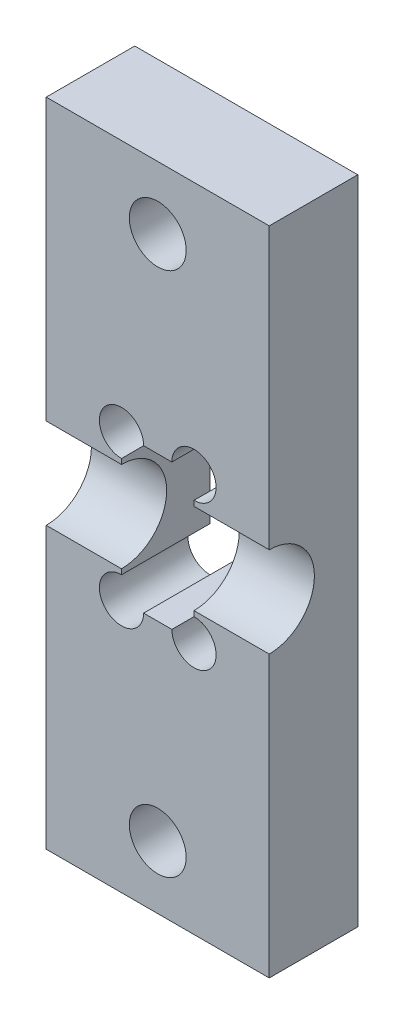
ISO-10303-21;
HEADER;
FILE_DESCRIPTION(('STEP AP214'),'2;1');
FILE_NAME('part.step','',(''),(''),'','','');
FILE_SCHEMA(('AUTOMOTIVE_DESIGN { 1 0 10303 214 1 1 1 1 }'));
ENDSEC;
DATA;
#1=APPLICATION_CONTEXT('core data for automotive mechanical design processes');
#2=APPLICATION_PROTOCOL_DEFINITION('international standard','automotive_design',2000,#1);
#3=PRODUCT_CONTEXT('',#1,'mechanical');
#4=PRODUCT('Part','Part','',(#3));
#5=PRODUCT_RELATED_PRODUCT_CATEGORY('part','',(#4));
#6=PRODUCT_DEFINITION_FORMATION('','',#4);
#7=PRODUCT_DEFINITION_CONTEXT('part definition',#1,'design');
#8=PRODUCT_DEFINITION('design','',#6,#7);
#9=PRODUCT_DEFINITION_SHAPE('','',#8);
#10=(LENGTH_UNIT() NAMED_UNIT(*) SI_UNIT(.MILLI.,.METRE.));
#11=(NAMED_UNIT(*) PLANE_ANGLE_UNIT() SI_UNIT($,.RADIAN.));
#12=(NAMED_UNIT(*) SI_UNIT($,.STERADIAN.) SOLID_ANGLE_UNIT());
#13=UNCERTAINTY_MEASURE_WITH_UNIT(LENGTH_MEASURE(1.E-05),#10,'distance_accuracy_value','');
#14=(GEOMETRIC_REPRESENTATION_CONTEXT(3) GLOBAL_UNCERTAINTY_ASSIGNED_CONTEXT((#13)) GLOBAL_UNIT_ASSIGNED_CONTEXT((#10,
#11,#12)) REPRESENTATION_CONTEXT('',''));
#15=CARTESIAN_POINT('',(0.,0.,0.));
#16=DIRECTION('',(0.,0.,1.));
#17=DIRECTION('',(1.,0.,0.));
#18=AXIS2_PLACEMENT_3D('',#15,#16,#17);
#19=CARTESIAN_POINT('',(0.,0.,7.9375));
#20=DIRECTION('',(0.,0.,-1.));
#21=DIRECTION('',(-1.,0.,0.));
#22=AXIS2_PLACEMENT_3D('',#19,#20,#21);
#23=PLANE('',#22);
#24=CARTESIAN_POINT('',(9.99999999999999,52.78,7.9375));
#25=DIRECTION('',(0.,0.,1.));
#26=DIRECTION('',(1.,0.,0.));
#27=AXIS2_PLACEMENT_3D('',#24,#25,#26);
#28=CIRCLE('',#27,2.54999999999999);
#29=CARTESIAN_POINT('',(12.55,52.78,7.9375));
#30=VERTEX_POINT('',#29);
#31=EDGE_CURVE('E184',#30,#30,#28,.T.);
#32=ORIENTED_EDGE('',*,*,#31,.F.);
#33=EDGE_LOOP('',(#32));
#34=FACE_BOUND('',#33,.T.);
#35=DIRECTION('',(0.,-1.,0.));
#36=VECTOR('',#35,1.);
#37=CARTESIAN_POINT('',(0.,0.,7.9375));
#38=LINE('',#37,#36);
#39=CARTESIAN_POINT('',(0.,58.42,7.9375));
#40=VERTEX_POINT('',#39);
#41=CARTESIAN_POINT('',(0.,33.26,7.9375));
#42=VERTEX_POINT('',#41);
#43=EDGE_CURVE('E158',#40,#42,#38,.T.);
#44=ORIENTED_EDGE('',*,*,#43,.T.);
#45=DIRECTION('',(1.,0.,0.));
#46=VECTOR('',#45,1.);
#47=CARTESIAN_POINT('',(0.,33.26,7.9375));
#48=LINE('',#47,#46);
#49=CARTESIAN_POINT('',(6.74999999999999,33.26,7.9375));
#50=VERTEX_POINT('',#49);
#51=EDGE_CURVE('E144',#42,#50,#48,.T.);
#52=ORIENTED_EDGE('',*,*,#51,.T.);
#53=DIRECTION('',(0.,-1.,0.));
#54=VECTOR('',#53,1.);
#55=CARTESIAN_POINT('',(6.74999999999999,33.725625,7.9375));
#56=LINE('',#55,#54);
#57=CARTESIAN_POINT('',(6.74999999999999,33.725625,7.9375));
#58=VERTEX_POINT('',#57);
#59=EDGE_CURVE('E302',#58,#50,#56,.T.);
#60=ORIENTED_EDGE('',*,*,#59,.F.);
#61=CARTESIAN_POINT('',(6.74999999999999,35.71,7.9375));
#62=DIRECTION('',(0.,0.,1.));
#63=DIRECTION('',(-1.,0.,0.));
#64=AXIS2_PLACEMENT_3D('',#61,#62,#63);
#65=CIRCLE('',#64,1.984375);
#66=CARTESIAN_POINT('',(8.73437499999999,35.71,7.9375));
#67=VERTEX_POINT('',#66);
#68=EDGE_CURVE('E305',#67,#58,#65,.T.);
#69=ORIENTED_EDGE('',*,*,#68,.F.);
#70=DIRECTION('',(-1.,0.,0.));
#71=VECTOR('',#70,1.);
#72=CARTESIAN_POINT('',(11.265625,35.71,7.9375));
#73=LINE('',#72,#71);
#74=CARTESIAN_POINT('',(11.265625,35.71,7.9375));
#75=VERTEX_POINT('',#74);
#76=EDGE_CURVE('E307',#75,#67,#73,.T.);
#77=ORIENTED_EDGE('',*,*,#76,.F.);
#78=CARTESIAN_POINT('',(13.25,35.71,7.9375));
#79=DIRECTION('',(0.,0.,1.));
#80=DIRECTION('',(1.,0.,0.));
#81=AXIS2_PLACEMENT_3D('',#78,#79,#80);
#82=CIRCLE('',#81,1.984375);
#83=CARTESIAN_POINT('',(13.25,33.725625,7.9375));
#84=VERTEX_POINT('',#83);
#85=EDGE_CURVE('E309',#84,#75,#82,.T.);
#86=ORIENTED_EDGE('',*,*,#85,.F.);
#87=DIRECTION('',(0.,1.,0.));
#88=VECTOR('',#87,1.);
#89=CARTESIAN_POINT('',(13.25,24.694375,7.9375));
#90=LINE('',#89,#88);
#91=CARTESIAN_POINT('',(13.25,33.26,7.9375));
#92=VERTEX_POINT('',#91);
#93=EDGE_CURVE('E314',#92,#84,#90,.T.);
#94=ORIENTED_EDGE('',*,*,#93,.F.);
#95=CARTESIAN_POINT('',(20.,33.26,7.9375));
#96=VERTEX_POINT('',#95);
#97=EDGE_CURVE('E49',#92,#96,#48,.T.);
#98=ORIENTED_EDGE('',*,*,#97,.T.);
#99=DIRECTION('',(0.,1.,0.));
#100=VECTOR('',#99,1.);
#101=CARTESIAN_POINT('',(20.,0.,7.9375));
#102=LINE('',#101,#100);
#103=CARTESIAN_POINT('',(20.,58.42,7.9375));
#104=VERTEX_POINT('',#103);
#105=EDGE_CURVE('E168',#96,#104,#102,.T.);
#106=ORIENTED_EDGE('',*,*,#105,.T.);
#107=DIRECTION('',(-1.,0.,0.));
#108=VECTOR('',#107,1.);
#109=CARTESIAN_POINT('',(0.,58.42,7.9375));
#110=LINE('',#109,#108);
#111=EDGE_CURVE('E164',#104,#40,#110,.T.);
#112=ORIENTED_EDGE('',*,*,#111,.T.);
#113=EDGE_LOOP('',(#44,#52,#60,#69,#77,#86,#94,#98,#106,#112));
#114=FACE_BOUND('',#113,.T.);
#115=ADVANCED_FACE('F34',(#34,#114),#23,.F.);
#116=CARTESIAN_POINT('',(10.,5.63999999999999,7.9375));
#117=DIRECTION('',(0.,0.,1.));
#118=DIRECTION('',(1.,0.,0.));
#119=AXIS2_PLACEMENT_3D('',#116,#117,#118);
#120=CIRCLE('',#119,2.55);
#121=CARTESIAN_POINT('',(12.55,5.63999999999999,7.9375));
#122=VERTEX_POINT('',#121);
#123=EDGE_CURVE('E243',#122,#122,#120,.T.);
#124=ORIENTED_EDGE('',*,*,#123,.F.);
#125=EDGE_LOOP('',(#124));
#126=FACE_BOUND('',#125,.T.);
#127=CARTESIAN_POINT('',(20.,0.,7.9375));
#128=VERTEX_POINT('',#127);
#129=CARTESIAN_POINT('',(20.,25.16,7.9375));
#130=VERTEX_POINT('',#129);
#131=EDGE_CURVE('E175',#128,#130,#102,.T.);
#132=ORIENTED_EDGE('',*,*,#131,.T.);
#133=DIRECTION('',(1.,0.,0.));
#134=VECTOR('',#133,1.);
#135=CARTESIAN_POINT('',(0.,25.16,7.9375));
#136=LINE('',#135,#134);
#137=CARTESIAN_POINT('',(13.25,25.16,7.9375));
#138=VERTEX_POINT('',#137);
#139=EDGE_CURVE('E152',#138,#130,#136,.T.);
#140=ORIENTED_EDGE('',*,*,#139,.F.);
#141=CARTESIAN_POINT('',(13.25,24.694375,7.9375));
#142=VERTEX_POINT('',#141);
#143=EDGE_CURVE('E311',#142,#138,#90,.T.);
#144=ORIENTED_EDGE('',*,*,#143,.F.);
#145=CARTESIAN_POINT('',(13.25,22.71,7.9375));
#146=DIRECTION('',(0.,0.,1.));
#147=DIRECTION('',(-1.,0.,0.));
#148=AXIS2_PLACEMENT_3D('',#145,#146,#147);
#149=CIRCLE('',#148,1.984375);
#150=CARTESIAN_POINT('',(11.265625,22.71,7.9375));
#151=VERTEX_POINT('',#150);
#152=EDGE_CURVE('E275',#151,#142,#149,.T.);
#153=ORIENTED_EDGE('',*,*,#152,.F.);
#154=DIRECTION('',(1.,0.,0.));
#155=VECTOR('',#154,1.);
#156=CARTESIAN_POINT('',(8.73437499999999,22.71,7.9375));
#157=LINE('',#156,#155);
#158=CARTESIAN_POINT('',(8.73437499999999,22.71,7.9375));
#159=VERTEX_POINT('',#158);
#160=EDGE_CURVE('E271',#159,#151,#157,.T.);
#161=ORIENTED_EDGE('',*,*,#160,.F.);
#162=CARTESIAN_POINT('',(6.74999999999999,22.71,7.9375));
#163=DIRECTION('',(0.,0.,1.));
#164=DIRECTION('',(-1.,0.,0.));
#165=AXIS2_PLACEMENT_3D('',#162,#163,#164);
#166=CIRCLE('',#165,1.984375);
#167=CARTESIAN_POINT('',(6.74999999999999,24.694375,7.9375));
#168=VERTEX_POINT('',#167);
#169=EDGE_CURVE('E299',#168,#159,#166,.T.);
#170=ORIENTED_EDGE('',*,*,#169,.F.);
#171=CARTESIAN_POINT('',(6.74999999999999,25.16,7.9375));
#172=VERTEX_POINT('',#171);
#173=EDGE_CURVE('E304',#172,#168,#56,.T.);
#174=ORIENTED_EDGE('',*,*,#173,.F.);
#175=CARTESIAN_POINT('',(0.,25.16,7.9375));
#176=VERTEX_POINT('',#175);
#177=EDGE_CURVE('E56',#176,#172,#136,.T.);
#178=ORIENTED_EDGE('',*,*,#177,.F.);
#179=CARTESIAN_POINT('',(0.,0.,7.9375));
#180=VERTEX_POINT('',#179);
#181=EDGE_CURVE('E160',#176,#180,#38,.T.);
#182=ORIENTED_EDGE('',*,*,#181,.T.);
#183=DIRECTION('',(1.,0.,0.));
#184=VECTOR('',#183,1.);
#185=CARTESIAN_POINT('',(0.,0.,7.9375));
#186=LINE('',#185,#184);
#187=EDGE_CURVE('E166',#180,#128,#186,.T.);
#188=ORIENTED_EDGE('',*,*,#187,.T.);
#189=EDGE_LOOP('',(#132,#140,#144,#153,#161,#170,#174,#178,#182,#188));
#190=FACE_BOUND('',#189,.T.);
#191=ADVANCED_FACE('F226',(#126,#190),#23,.F.);
#192=CARTESIAN_POINT('',(0.,0.,0.));
#193=DIRECTION('',(0.,0.,-1.));
#194=DIRECTION('',(-1.,0.,0.));
#195=AXIS2_PLACEMENT_3D('',#192,#193,#194);
#196=PLANE('',#195);
#197=CARTESIAN_POINT('',(9.99999999999999,52.78,0.));
#198=DIRECTION('',(0.,0.,1.));
#199=DIRECTION('',(1.,0.,0.));
#200=AXIS2_PLACEMENT_3D('',#197,#198,#199);
#201=CIRCLE('',#200,2.54999999999999);
#202=CARTESIAN_POINT('',(12.55,52.78,0.));
#203=VERTEX_POINT('',#202);
#204=EDGE_CURVE('E172',#203,#203,#201,.T.);
#205=ORIENTED_EDGE('',*,*,#204,.T.);
#206=EDGE_LOOP('',(#205));
#207=FACE_BOUND('',#206,.T.);
#208=DIRECTION('',(0.,-1.,0.));
#209=VECTOR('',#208,1.);
#210=CARTESIAN_POINT('',(0.,0.,0.));
#211=LINE('',#210,#209);
#212=CARTESIAN_POINT('',(0.,58.42,0.));
#213=VERTEX_POINT('',#212);
#214=CARTESIAN_POINT('',(0.,0.,0.));
#215=VERTEX_POINT('',#214);
#216=EDGE_CURVE('E180',#213,#215,#211,.T.);
#217=ORIENTED_EDGE('',*,*,#216,.F.);
#218=DIRECTION('',(-1.,0.,0.));
#219=VECTOR('',#218,1.);
#220=CARTESIAN_POINT('',(0.,58.42,0.));
#221=LINE('',#220,#219);
#222=CARTESIAN_POINT('',(20.,58.42,0.));
#223=VERTEX_POINT('',#222);
#224=EDGE_CURVE('E170',#223,#213,#221,.T.);
#225=ORIENTED_EDGE('',*,*,#224,.F.);
#226=DIRECTION('',(0.,1.,0.));
#227=VECTOR('',#226,1.);
#228=CARTESIAN_POINT('',(20.,0.,0.));
#229=LINE('',#228,#227);
#230=CARTESIAN_POINT('',(20.,0.,0.));
#231=VERTEX_POINT('',#230);
#232=EDGE_CURVE('E186',#231,#223,#229,.T.);
#233=ORIENTED_EDGE('',*,*,#232,.F.);
#234=DIRECTION('',(1.,0.,0.));
#235=VECTOR('',#234,1.);
#236=CARTESIAN_POINT('',(0.,0.,0.));
#237=LINE('',#236,#235);
#238=EDGE_CURVE('E183',#215,#231,#237,.T.);
#239=ORIENTED_EDGE('',*,*,#238,.F.);
#240=EDGE_LOOP('',(#217,#225,#233,#239));
#241=FACE_BOUND('',#240,.T.);
#242=CARTESIAN_POINT('',(10.,5.63999999999999,0.));
#243=DIRECTION('',(0.,0.,1.));
#244=DIRECTION('',(1.,0.,0.));
#245=AXIS2_PLACEMENT_3D('',#242,#243,#244);
#246=CIRCLE('',#245,2.55);
#247=CARTESIAN_POINT('',(12.55,5.63999999999999,0.));
#248=VERTEX_POINT('',#247);
#249=EDGE_CURVE('E246',#248,#248,#246,.T.);
#250=ORIENTED_EDGE('',*,*,#249,.T.);
#251=EDGE_LOOP('',(#250));
#252=FACE_BOUND('',#251,.T.);
#253=DIRECTION('',(1.,0.,0.));
#254=VECTOR('',#253,1.);
#255=CARTESIAN_POINT('',(8.73437499999999,22.71,0.));
#256=LINE('',#255,#254);
#257=CARTESIAN_POINT('',(8.73437499999999,22.71,0.));
#258=VERTEX_POINT('',#257);
#259=CARTESIAN_POINT('',(11.265625,22.71,0.));
#260=VERTEX_POINT('',#259);
#261=EDGE_CURVE('E272',#258,#260,#256,.T.);
#262=ORIENTED_EDGE('',*,*,#261,.T.);
#263=CARTESIAN_POINT('',(13.25,22.71,0.));
#264=DIRECTION('',(0.,0.,1.));
#265=DIRECTION('',(-1.,0.,0.));
#266=AXIS2_PLACEMENT_3D('',#263,#264,#265);
#267=CIRCLE('',#266,1.984375);
#268=CARTESIAN_POINT('',(13.25,24.694375,0.));
#269=VERTEX_POINT('',#268);
#270=EDGE_CURVE('E294',#260,#269,#267,.T.);
#271=ORIENTED_EDGE('',*,*,#270,.T.);
#272=DIRECTION('',(0.,1.,0.));
#273=VECTOR('',#272,1.);
#274=CARTESIAN_POINT('',(13.25,24.694375,0.));
#275=LINE('',#274,#273);
#276=CARTESIAN_POINT('',(13.25,33.725625,0.));
#277=VERTEX_POINT('',#276);
#278=EDGE_CURVE('E291',#269,#277,#275,.T.);
#279=ORIENTED_EDGE('',*,*,#278,.T.);
#280=CARTESIAN_POINT('',(13.25,35.71,0.));
#281=DIRECTION('',(0.,0.,1.));
#282=DIRECTION('',(1.,0.,0.));
#283=AXIS2_PLACEMENT_3D('',#280,#281,#282);
#284=CIRCLE('',#283,1.984375);
#285=CARTESIAN_POINT('',(11.265625,35.71,0.));
#286=VERTEX_POINT('',#285);
#287=EDGE_CURVE('E288',#277,#286,#284,.T.);
#288=ORIENTED_EDGE('',*,*,#287,.T.);
#289=DIRECTION('',(-1.,0.,0.));
#290=VECTOR('',#289,1.);
#291=CARTESIAN_POINT('',(11.265625,35.71,0.));
#292=LINE('',#291,#290);
#293=CARTESIAN_POINT('',(8.73437499999999,35.71,0.));
#294=VERTEX_POINT('',#293);
#295=EDGE_CURVE('E285',#286,#294,#292,.T.);
#296=ORIENTED_EDGE('',*,*,#295,.T.);
#297=CARTESIAN_POINT('',(6.74999999999999,35.71,0.));
#298=DIRECTION('',(0.,0.,1.));
#299=DIRECTION('',(-1.,0.,0.));
#300=AXIS2_PLACEMENT_3D('',#297,#298,#299);
#301=CIRCLE('',#300,1.984375);
#302=CARTESIAN_POINT('',(6.74999999999999,33.725625,0.));
#303=VERTEX_POINT('',#302);
#304=EDGE_CURVE('E282',#294,#303,#301,.T.);
#305=ORIENTED_EDGE('',*,*,#304,.T.);
#306=DIRECTION('',(0.,-1.,0.));
#307=VECTOR('',#306,1.);
#308=CARTESIAN_POINT('',(6.74999999999999,33.725625,0.));
#309=LINE('',#308,#307);
#310=CARTESIAN_POINT('',(6.74999999999999,24.694375,0.));
#311=VERTEX_POINT('',#310);
#312=EDGE_CURVE('E279',#303,#311,#309,.T.);
#313=ORIENTED_EDGE('',*,*,#312,.T.);
#314=CARTESIAN_POINT('',(6.74999999999999,22.71,0.));
#315=DIRECTION('',(0.,0.,1.));
#316=DIRECTION('',(-1.,0.,0.));
#317=AXIS2_PLACEMENT_3D('',#314,#315,#316);
#318=CIRCLE('',#317,1.984375);
#319=EDGE_CURVE('E276',#311,#258,#318,.T.);
#320=ORIENTED_EDGE('',*,*,#319,.T.);
#321=EDGE_LOOP('',(#262,#271,#279,#288,#296,#305,#313,#320));
#322=FACE_BOUND('',#321,.T.);
#323=ADVANCED_FACE('F203',(#207,#241,#252,#322),#196,.T.);
#324=CARTESIAN_POINT('',(0.,0.,7.9375));
#325=DIRECTION('',(1.,0.,0.));
#326=DIRECTION('',(0.,1.,0.));
#327=AXIS2_PLACEMENT_3D('',#324,#325,#326);
#328=PLANE('',#327);
#329=ORIENTED_EDGE('',*,*,#181,.F.);
#330=CARTESIAN_POINT('',(0.,29.21,7.9375));
#331=DIRECTION('',(1.,0.,0.));
#332=DIRECTION('',(0.,1.,0.));
#333=AXIS2_PLACEMENT_3D('',#330,#331,#332);
#334=CIRCLE('',#333,4.05);
#335=EDGE_CURVE('E147',#176,#42,#334,.T.);
#336=ORIENTED_EDGE('',*,*,#335,.T.);
#337=ORIENTED_EDGE('',*,*,#43,.F.);
#338=DIRECTION('',(0.,0.,-1.));
#339=VECTOR('',#338,1.);
#340=CARTESIAN_POINT('',(0.,58.42,7.9375));
#341=LINE('',#340,#339);
#342=EDGE_CURVE('E179',#40,#213,#341,.T.);
#343=ORIENTED_EDGE('',*,*,#342,.T.);
#344=ORIENTED_EDGE('',*,*,#216,.T.);
#345=DIRECTION('',(0.,0.,-1.));
#346=VECTOR('',#345,1.);
#347=CARTESIAN_POINT('',(0.,0.,7.9375));
#348=LINE('',#347,#346);
#349=EDGE_CURVE('E42',#180,#215,#348,.T.);
#350=ORIENTED_EDGE('',*,*,#349,.F.);
#351=EDGE_LOOP('',(#329,#336,#337,#343,#344,#350));
#352=FACE_BOUND('',#351,.T.);
#353=ADVANCED_FACE('F36',(#352),#328,.F.);
#354=CARTESIAN_POINT('',(0.,0.,7.9375));
#355=DIRECTION('',(0.,1.,0.));
#356=DIRECTION('',(-1.,0.,0.));
#357=AXIS2_PLACEMENT_3D('',#354,#355,#356);
#358=PLANE('',#357);
#359=ORIENTED_EDGE('',*,*,#238,.T.);
#360=DIRECTION('',(0.,0.,-1.));
#361=VECTOR('',#360,1.);
#362=CARTESIAN_POINT('',(20.,0.,7.9375));
#363=LINE('',#362,#361);
#364=EDGE_CURVE('E193',#128,#231,#363,.T.);
#365=ORIENTED_EDGE('',*,*,#364,.F.);
#366=ORIENTED_EDGE('',*,*,#187,.F.);
#367=ORIENTED_EDGE('',*,*,#349,.T.);
#368=EDGE_LOOP('',(#359,#365,#366,#367));
#369=FACE_BOUND('',#368,.T.);
#370=ADVANCED_FACE('F198',(#369),#358,.F.);
#371=CARTESIAN_POINT('',(20.,0.,7.9375));
#372=DIRECTION('',(-1.,0.,0.));
#373=DIRECTION('',(0.,-1.,0.));
#374=AXIS2_PLACEMENT_3D('',#371,#372,#373);
#375=PLANE('',#374);
#376=ORIENTED_EDGE('',*,*,#105,.F.);
#377=CARTESIAN_POINT('',(20.,29.21,7.9375));
#378=DIRECTION('',(1.,0.,0.));
#379=DIRECTION('',(0.,1.,0.));
#380=AXIS2_PLACEMENT_3D('',#377,#378,#379);
#381=CIRCLE('',#380,4.05);
#382=EDGE_CURVE('E161',#130,#96,#381,.T.);
#383=ORIENTED_EDGE('',*,*,#382,.F.);
#384=ORIENTED_EDGE('',*,*,#131,.F.);
#385=ORIENTED_EDGE('',*,*,#364,.T.);
#386=ORIENTED_EDGE('',*,*,#232,.T.);
#387=DIRECTION('',(0.,0.,-1.));
#388=VECTOR('',#387,1.);
#389=CARTESIAN_POINT('',(20.,58.42,7.9375));
#390=LINE('',#389,#388);
#391=EDGE_CURVE('E190',#104,#223,#390,.T.);
#392=ORIENTED_EDGE('',*,*,#391,.F.);
#393=EDGE_LOOP('',(#376,#383,#384,#385,#386,#392));
#394=FACE_BOUND('',#393,.T.);
#395=ADVANCED_FACE('F209',(#394),#375,.F.);
#396=CARTESIAN_POINT('',(0.,58.42,7.9375));
#397=DIRECTION('',(0.,-1.,0.));
#398=DIRECTION('',(1.,0.,0.));
#399=AXIS2_PLACEMENT_3D('',#396,#397,#398);
#400=PLANE('',#399);
#401=ORIENTED_EDGE('',*,*,#224,.T.);
#402=ORIENTED_EDGE('',*,*,#342,.F.);
#403=ORIENTED_EDGE('',*,*,#111,.F.);
#404=ORIENTED_EDGE('',*,*,#391,.T.);
#405=EDGE_LOOP('',(#401,#402,#403,#404));
#406=FACE_BOUND('',#405,.T.);
#407=ADVANCED_FACE('F212',(#406),#400,.F.);
#408=CARTESIAN_POINT('',(9.99999999999999,52.78,7.9375));
#409=DIRECTION('',(0.,0.,-1.));
#410=DIRECTION('',(-1.,0.,0.));
#411=AXIS2_PLACEMENT_3D('',#408,#409,#410);
#412=CYLINDRICAL_SURFACE('',#411,2.54999999999999);
#413=ORIENTED_EDGE('',*,*,#31,.T.);
#414=EDGE_LOOP('',(#413));
#415=FACE_BOUND('',#414,.T.);
#416=ORIENTED_EDGE('',*,*,#204,.F.);
#417=EDGE_LOOP('',(#416));
#418=FACE_BOUND('',#417,.T.);
#419=ADVANCED_FACE('F214',(#415,#418),#412,.F.);
#420=CARTESIAN_POINT('',(10.,5.63999999999999,7.9375));
#421=DIRECTION('',(0.,0.,-1.));
#422=DIRECTION('',(-1.,0.,0.));
#423=AXIS2_PLACEMENT_3D('',#420,#421,#422);
#424=CYLINDRICAL_SURFACE('',#423,2.55);
#425=ORIENTED_EDGE('',*,*,#123,.T.);
#426=EDGE_LOOP('',(#425));
#427=FACE_BOUND('',#426,.T.);
#428=ORIENTED_EDGE('',*,*,#249,.F.);
#429=EDGE_LOOP('',(#428));
#430=FACE_BOUND('',#429,.T.);
#431=ADVANCED_FACE('F220',(#427,#430),#424,.F.);
#432=CARTESIAN_POINT('',(13.25,22.71,7.9375));
#433=DIRECTION('',(0.,0.,-1.));
#434=DIRECTION('',(-1.,0.,0.));
#435=AXIS2_PLACEMENT_3D('',#432,#433,#434);
#436=CYLINDRICAL_SURFACE('',#435,1.984375);
#437=ORIENTED_EDGE('',*,*,#270,.F.);
#438=DIRECTION('',(0.,0.,-1.));
#439=VECTOR('',#438,1.);
#440=CARTESIAN_POINT('',(11.265625,22.71,7.9375));
#441=LINE('',#440,#439);
#442=EDGE_CURVE('E268',#151,#260,#441,.T.);
#443=ORIENTED_EDGE('',*,*,#442,.F.);
#444=ORIENTED_EDGE('',*,*,#152,.T.);
#445=DIRECTION('',(0.,0.,-1.));
#446=VECTOR('',#445,1.);
#447=CARTESIAN_POINT('',(13.25,24.694375,7.9375));
#448=LINE('',#447,#446);
#449=EDGE_CURVE('E251',#142,#269,#448,.T.);
#450=ORIENTED_EDGE('',*,*,#449,.T.);
#451=EDGE_LOOP('',(#437,#443,#444,#450));
#452=FACE_BOUND('',#451,.T.);
#453=ADVANCED_FACE('F336',(#452),#436,.F.);
#454=CARTESIAN_POINT('',(13.25,24.694375,7.9375));
#455=DIRECTION('',(-1.,0.,0.));
#456=DIRECTION('',(0.,0.,1.));
#457=AXIS2_PLACEMENT_3D('',#454,#455,#456);
#458=PLANE('',#457);
#459=CARTESIAN_POINT('',(13.25,29.21,7.9375));
#460=DIRECTION('',(-1.,0.,0.));
#461=DIRECTION('',(0.,0.,1.));
#462=AXIS2_PLACEMENT_3D('',#459,#460,#461);
#463=CIRCLE('',#462,4.05);
#464=EDGE_CURVE('E297',#92,#138,#463,.T.);
#465=ORIENTED_EDGE('',*,*,#464,.F.);
#466=ORIENTED_EDGE('',*,*,#93,.T.);
#467=DIRECTION('',(0.,0.,-1.));
#468=VECTOR('',#467,1.);
#469=CARTESIAN_POINT('',(13.25,33.725625,7.9375));
#470=LINE('',#469,#468);
#471=EDGE_CURVE('E256',#84,#277,#470,.T.);
#472=ORIENTED_EDGE('',*,*,#471,.T.);
#473=ORIENTED_EDGE('',*,*,#278,.F.);
#474=ORIENTED_EDGE('',*,*,#449,.F.);
#475=ORIENTED_EDGE('',*,*,#143,.T.);
#476=EDGE_LOOP('',(#465,#466,#472,#473,#474,#475));
#477=FACE_BOUND('',#476,.T.);
#478=ADVANCED_FACE('F326',(#477),#458,.T.);
#479=CARTESIAN_POINT('',(13.25,35.71,7.9375));
#480=DIRECTION('',(0.,0.,-1.));
#481=DIRECTION('',(-1.,0.,0.));
#482=AXIS2_PLACEMENT_3D('',#479,#480,#481);
#483=CYLINDRICAL_SURFACE('',#482,1.984375);
#484=ORIENTED_EDGE('',*,*,#287,.F.);
#485=ORIENTED_EDGE('',*,*,#471,.F.);
#486=ORIENTED_EDGE('',*,*,#85,.T.);
#487=DIRECTION('',(0.,0.,-1.));
#488=VECTOR('',#487,1.);
#489=CARTESIAN_POINT('',(11.265625,35.71,7.9375));
#490=LINE('',#489,#488);
#491=EDGE_CURVE('E258',#75,#286,#490,.T.);
#492=ORIENTED_EDGE('',*,*,#491,.T.);
#493=EDGE_LOOP('',(#484,#485,#486,#492));
#494=FACE_BOUND('',#493,.T.);
#495=ADVANCED_FACE('F329',(#494),#483,.F.);
#496=CARTESIAN_POINT('',(11.265625,35.71,7.9375));
#497=DIRECTION('',(0.,-1.,0.));
#498=DIRECTION('',(0.,0.,-1.));
#499=AXIS2_PLACEMENT_3D('',#496,#497,#498);
#500=PLANE('',#499);
#501=ORIENTED_EDGE('',*,*,#295,.F.);
#502=ORIENTED_EDGE('',*,*,#491,.F.);
#503=ORIENTED_EDGE('',*,*,#76,.T.);
#504=DIRECTION('',(0.,0.,-1.));
#505=VECTOR('',#504,1.);
#506=CARTESIAN_POINT('',(8.73437499999999,35.71,7.9375));
#507=LINE('',#506,#505);
#508=EDGE_CURVE('E260',#67,#294,#507,.T.);
#509=ORIENTED_EDGE('',*,*,#508,.T.);
#510=EDGE_LOOP('',(#501,#502,#503,#509));
#511=FACE_BOUND('',#510,.T.);
#512=ADVANCED_FACE('F358',(#511),#500,.T.);
#513=CARTESIAN_POINT('',(6.74999999999999,35.71,7.9375));
#514=DIRECTION('',(0.,0.,-1.));
#515=DIRECTION('',(-1.,0.,0.));
#516=AXIS2_PLACEMENT_3D('',#513,#514,#515);
#517=CYLINDRICAL_SURFACE('',#516,1.984375);
#518=ORIENTED_EDGE('',*,*,#304,.F.);
#519=ORIENTED_EDGE('',*,*,#508,.F.);
#520=ORIENTED_EDGE('',*,*,#68,.T.);
#521=DIRECTION('',(0.,0.,-1.));
#522=VECTOR('',#521,1.);
#523=CARTESIAN_POINT('',(6.74999999999999,33.725625,7.9375));
#524=LINE('',#523,#522);
#525=EDGE_CURVE('E262',#58,#303,#524,.T.);
#526=ORIENTED_EDGE('',*,*,#525,.T.);
#527=EDGE_LOOP('',(#518,#519,#520,#526));
#528=FACE_BOUND('',#527,.T.);
#529=ADVANCED_FACE('F356',(#528),#517,.F.);
#530=CARTESIAN_POINT('',(6.74999999999999,33.725625,7.9375));
#531=DIRECTION('',(1.,0.,0.));
#532=DIRECTION('',(0.,1.,0.));
#533=AXIS2_PLACEMENT_3D('',#530,#531,#532);
#534=PLANE('',#533);
#535=CARTESIAN_POINT('',(6.74999999999999,29.21,7.9375));
#536=DIRECTION('',(1.,0.,0.));
#537=DIRECTION('',(0.,1.,0.));
#538=AXIS2_PLACEMENT_3D('',#535,#536,#537);
#539=CIRCLE('',#538,4.05);
#540=EDGE_CURVE('E11',#172,#50,#539,.T.);
#541=ORIENTED_EDGE('',*,*,#540,.F.);
#542=ORIENTED_EDGE('',*,*,#173,.T.);
#543=DIRECTION('',(0.,0.,-1.));
#544=VECTOR('',#543,1.);
#545=CARTESIAN_POINT('',(6.74999999999999,24.694375,7.9375));
#546=LINE('',#545,#544);
#547=EDGE_CURVE('E264',#168,#311,#546,.T.);
#548=ORIENTED_EDGE('',*,*,#547,.T.);
#549=ORIENTED_EDGE('',*,*,#312,.F.);
#550=ORIENTED_EDGE('',*,*,#525,.F.);
#551=ORIENTED_EDGE('',*,*,#59,.T.);
#552=EDGE_LOOP('',(#541,#542,#548,#549,#550,#551));
#553=FACE_BOUND('',#552,.T.);
#554=ADVANCED_FACE('F345',(#553),#534,.T.);
#555=CARTESIAN_POINT('',(6.74999999999999,22.71,7.9375));
#556=DIRECTION('',(0.,0.,-1.));
#557=DIRECTION('',(-1.,0.,0.));
#558=AXIS2_PLACEMENT_3D('',#555,#556,#557);
#559=CYLINDRICAL_SURFACE('',#558,1.984375);
#560=ORIENTED_EDGE('',*,*,#319,.F.);
#561=ORIENTED_EDGE('',*,*,#547,.F.);
#562=ORIENTED_EDGE('',*,*,#169,.T.);
#563=DIRECTION('',(0.,0.,-1.));
#564=VECTOR('',#563,1.);
#565=CARTESIAN_POINT('',(8.73437499999999,22.71,7.9375));
#566=LINE('',#565,#564);
#567=EDGE_CURVE('E266',#159,#258,#566,.T.);
#568=ORIENTED_EDGE('',*,*,#567,.T.);
#569=EDGE_LOOP('',(#560,#561,#562,#568));
#570=FACE_BOUND('',#569,.T.);
#571=ADVANCED_FACE('F349',(#570),#559,.F.);
#572=CARTESIAN_POINT('',(8.73437499999999,22.71,7.9375));
#573=DIRECTION('',(0.,1.,0.));
#574=DIRECTION('',(0.,0.,1.));
#575=AXIS2_PLACEMENT_3D('',#572,#573,#574);
#576=PLANE('',#575);
#577=ORIENTED_EDGE('',*,*,#261,.F.);
#578=ORIENTED_EDGE('',*,*,#567,.F.);
#579=ORIENTED_EDGE('',*,*,#160,.T.);
#580=ORIENTED_EDGE('',*,*,#442,.T.);
#581=EDGE_LOOP('',(#577,#578,#579,#580));
#582=FACE_BOUND('',#581,.T.);
#583=ADVANCED_FACE('F414',(#582),#576,.T.);
#584=CARTESIAN_POINT('',(0.,29.21,7.9375));
#585=DIRECTION('',(1.,0.,0.));
#586=DIRECTION('',(0.,1.,0.));
#587=AXIS2_PLACEMENT_3D('',#584,#585,#586);
#588=CYLINDRICAL_SURFACE('',#587,4.05);
#589=ORIENTED_EDGE('',*,*,#540,.T.);
#590=ORIENTED_EDGE('',*,*,#51,.F.);
#591=ORIENTED_EDGE('',*,*,#335,.F.);
#592=ORIENTED_EDGE('',*,*,#177,.T.);
#593=EDGE_LOOP('',(#589,#590,#591,#592));
#594=FACE_BOUND('',#593,.T.);
#595=ADVANCED_FACE('F146',(#594),#588,.F.);
#596=ORIENTED_EDGE('',*,*,#464,.T.);
#597=ORIENTED_EDGE('',*,*,#139,.T.);
#598=ORIENTED_EDGE('',*,*,#382,.T.);
#599=ORIENTED_EDGE('',*,*,#97,.F.);
#600=EDGE_LOOP('',(#596,#597,#598,#599));
#601=FACE_BOUND('',#600,.T.);
#602=ADVANCED_FACE('F319',(#601),#588,.F.);
#603=CLOSED_SHELL('',(#115,#191,#323,#353,#370,#395,#407,#419,#431,#453,#478,#495,#512,#529,
#554,#571,#583,#595,#602));
#604=MANIFOLD_SOLID_BREP('B2',#603);
#605=ADVANCED_BREP_SHAPE_REPRESENTATION('',(#18,#604),#14);
#606=SHAPE_DEFINITION_REPRESENTATION(#9,#605);
ENDSEC;
END-ISO-10303-21;
